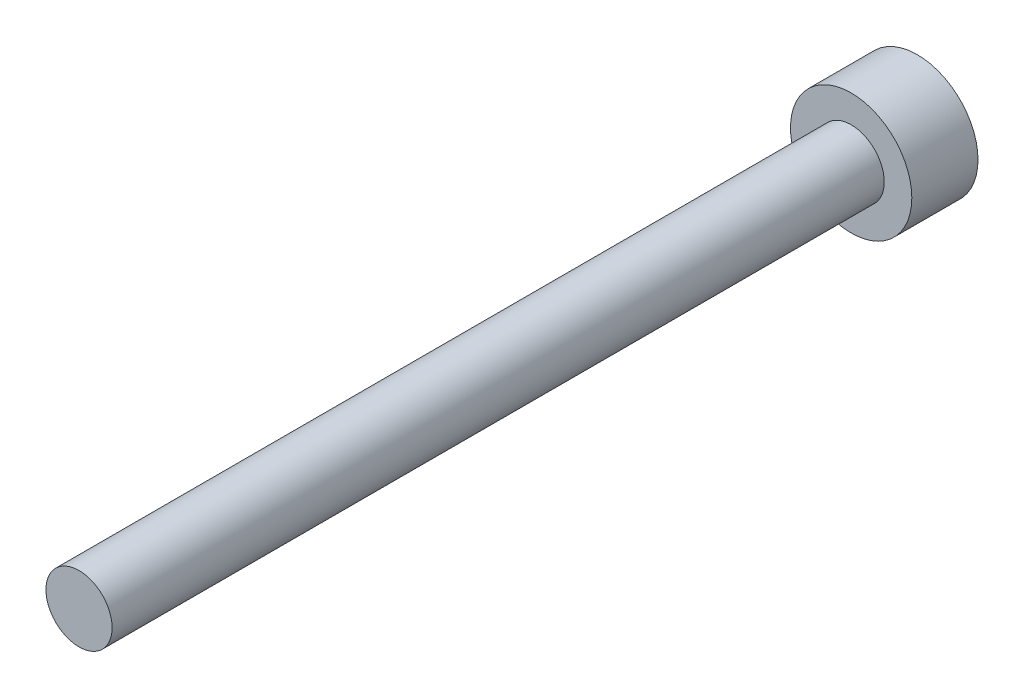
ISO-10303-21;
HEADER;
FILE_DESCRIPTION(('STEP AP214'),'2;1');
FILE_NAME('part.step','',(''),(''),'','','');
FILE_SCHEMA(('AUTOMOTIVE_DESIGN { 1 0 10303 214 1 1 1 1 }'));
ENDSEC;
DATA;
#1=APPLICATION_CONTEXT('core data for automotive mechanical design processes');
#2=APPLICATION_PROTOCOL_DEFINITION('international standard','automotive_design',2000,#1);
#3=PRODUCT_CONTEXT('',#1,'mechanical');
#4=PRODUCT('Part','Part','',(#3));
#5=PRODUCT_RELATED_PRODUCT_CATEGORY('part','',(#4));
#6=PRODUCT_DEFINITION_FORMATION('','',#4);
#7=PRODUCT_DEFINITION_CONTEXT('part definition',#1,'design');
#8=PRODUCT_DEFINITION('design','',#6,#7);
#9=PRODUCT_DEFINITION_SHAPE('','',#8);
#10=(LENGTH_UNIT() NAMED_UNIT(*) SI_UNIT(.MILLI.,.METRE.));
#11=(NAMED_UNIT(*) PLANE_ANGLE_UNIT() SI_UNIT($,.RADIAN.));
#12=(NAMED_UNIT(*) SI_UNIT($,.STERADIAN.) SOLID_ANGLE_UNIT());
#13=UNCERTAINTY_MEASURE_WITH_UNIT(LENGTH_MEASURE(1.E-05),#10,'distance_accuracy_value','');
#14=(GEOMETRIC_REPRESENTATION_CONTEXT(3) GLOBAL_UNCERTAINTY_ASSIGNED_CONTEXT((#13)) GLOBAL_UNIT_ASSIGNED_CONTEXT((#10,
#11,#12)) REPRESENTATION_CONTEXT('',''));
#15=CARTESIAN_POINT('',(0.,0.,0.));
#16=DIRECTION('',(0.,0.,1.));
#17=DIRECTION('',(1.,0.,0.));
#18=AXIS2_PLACEMENT_3D('',#15,#16,#17);
#19=CARTESIAN_POINT('',(0.,0.,-3.));
#20=DIRECTION('',(0.,0.,1.));
#21=DIRECTION('',(1.,0.,0.));
#22=AXIS2_PLACEMENT_3D('',#19,#20,#21);
#23=PLANE('',#22);
#24=CARTESIAN_POINT('',(0.,0.,-3.));
#25=DIRECTION('',(0.,0.,1.));
#26=DIRECTION('',(1.,0.,0.));
#27=AXIS2_PLACEMENT_3D('',#24,#25,#26);
#28=CIRCLE('',#27,2.75);
#29=CARTESIAN_POINT('',(2.75,0.,-3.));
#30=VERTEX_POINT('',#29);
#31=EDGE_CURVE('E47',#30,#30,#28,.T.);
#32=ORIENTED_EDGE('',*,*,#31,.F.);
#33=EDGE_LOOP('',(#32));
#34=FACE_BOUND('',#33,.T.);
#35=DIRECTION('',(0.5,0.866025403784439,0.));
#36=VECTOR('',#35,1.);
#37=CARTESIAN_POINT('',(0.721687836487032,-1.25,-3.));
#38=LINE('',#37,#36);
#39=CARTESIAN_POINT('',(0.721687836487032,-1.25,-3.));
#40=VERTEX_POINT('',#39);
#41=CARTESIAN_POINT('',(1.44337567297406,0.,-3.));
#42=VERTEX_POINT('',#41);
#43=EDGE_CURVE('E62',#40,#42,#38,.T.);
#44=ORIENTED_EDGE('',*,*,#43,.T.);
#45=DIRECTION('',(-0.5,0.866025403784439,0.));
#46=VECTOR('',#45,1.);
#47=CARTESIAN_POINT('',(1.44337567297406,0.,-3.));
#48=LINE('',#47,#46);
#49=CARTESIAN_POINT('',(0.721687836487032,1.25,-3.));
#50=VERTEX_POINT('',#49);
#51=EDGE_CURVE('E138',#42,#50,#48,.T.);
#52=ORIENTED_EDGE('',*,*,#51,.T.);
#53=DIRECTION('',(-1.,0.,0.));
#54=VECTOR('',#53,1.);
#55=CARTESIAN_POINT('',(0.721687836487032,1.25,-3.));
#56=LINE('',#55,#54);
#57=CARTESIAN_POINT('',(-0.721687836487032,1.25,-3.));
#58=VERTEX_POINT('',#57);
#59=EDGE_CURVE('E141',#50,#58,#56,.T.);
#60=ORIENTED_EDGE('',*,*,#59,.T.);
#61=DIRECTION('',(-0.5,-0.866025403784439,0.));
#62=VECTOR('',#61,1.);
#63=CARTESIAN_POINT('',(-0.721687836487032,1.25,-3.));
#64=LINE('',#63,#62);
#65=CARTESIAN_POINT('',(-1.44337567297406,0.,-3.));
#66=VERTEX_POINT('',#65);
#67=EDGE_CURVE('E150',#58,#66,#64,.T.);
#68=ORIENTED_EDGE('',*,*,#67,.T.);
#69=DIRECTION('',(0.5,-0.866025403784439,0.));
#70=VECTOR('',#69,1.);
#71=CARTESIAN_POINT('',(-1.44337567297406,0.,-3.));
#72=LINE('',#71,#70);
#73=CARTESIAN_POINT('',(-0.721687836487033,-1.25,-3.));
#74=VERTEX_POINT('',#73);
#75=EDGE_CURVE('E125',#66,#74,#72,.T.);
#76=ORIENTED_EDGE('',*,*,#75,.T.);
#77=DIRECTION('',(1.,0.,0.));
#78=VECTOR('',#77,1.);
#79=CARTESIAN_POINT('',(-0.721687836487033,-1.25,-3.));
#80=LINE('',#79,#78);
#81=EDGE_CURVE('E155',#74,#40,#80,.T.);
#82=ORIENTED_EDGE('',*,*,#81,.T.);
#83=EDGE_LOOP('',(#44,#52,#60,#68,#76,#82));
#84=FACE_BOUND('',#83,.T.);
#85=ADVANCED_FACE('F44',(#34,#84),#23,.F.);
#86=CARTESIAN_POINT('',(0.,0.,0.));
#87=DIRECTION('',(0.,0.,-1.));
#88=DIRECTION('',(-1.,0.,0.));
#89=AXIS2_PLACEMENT_3D('',#86,#87,#88);
#90=CYLINDRICAL_SURFACE('',#89,2.75);
#91=CARTESIAN_POINT('',(0.,0.,0.));
#92=DIRECTION('',(0.,0.,1.));
#93=DIRECTION('',(1.,0.,0.));
#94=AXIS2_PLACEMENT_3D('',#91,#92,#93);
#95=CIRCLE('',#94,2.75);
#96=CARTESIAN_POINT('',(2.75,0.,0.));
#97=VERTEX_POINT('',#96);
#98=EDGE_CURVE('E54',#97,#97,#95,.T.);
#99=ORIENTED_EDGE('',*,*,#98,.F.);
#100=EDGE_LOOP('',(#99));
#101=FACE_BOUND('',#100,.T.);
#102=ORIENTED_EDGE('',*,*,#31,.T.);
#103=EDGE_LOOP('',(#102));
#104=FACE_BOUND('',#103,.T.);
#105=ADVANCED_FACE('F50',(#101,#104),#90,.T.);
#106=CARTESIAN_POINT('',(0.,0.,0.));
#107=DIRECTION('',(0.,0.,1.));
#108=DIRECTION('',(1.,0.,0.));
#109=AXIS2_PLACEMENT_3D('',#106,#107,#108);
#110=PLANE('',#109);
#111=CARTESIAN_POINT('',(0.,0.,0.));
#112=DIRECTION('',(0.,0.,1.));
#113=DIRECTION('',(1.,0.,0.));
#114=AXIS2_PLACEMENT_3D('',#111,#112,#113);
#115=CIRCLE('',#114,1.5);
#116=CARTESIAN_POINT('',(1.5,0.,0.));
#117=VERTEX_POINT('',#116);
#118=EDGE_CURVE('E11',#117,#117,#115,.T.);
#119=ORIENTED_EDGE('',*,*,#118,.F.);
#120=EDGE_LOOP('',(#119));
#121=FACE_BOUND('',#120,.T.);
#122=ORIENTED_EDGE('',*,*,#98,.T.);
#123=EDGE_LOOP('',(#122));
#124=FACE_BOUND('',#123,.T.);
#125=ADVANCED_FACE('F212',(#121,#124),#110,.T.);
#126=CARTESIAN_POINT('',(0.,0.,35.));
#127=DIRECTION('',(0.,0.,-1.));
#128=DIRECTION('',(-1.,0.,0.));
#129=AXIS2_PLACEMENT_3D('',#126,#127,#128);
#130=CYLINDRICAL_SURFACE('',#129,1.5);
#131=CARTESIAN_POINT('',(0.,0.,35.));
#132=DIRECTION('',(0.,0.,1.));
#133=DIRECTION('',(1.,0.,0.));
#134=AXIS2_PLACEMENT_3D('',#131,#132,#133);
#135=CIRCLE('',#134,1.5);
#136=CARTESIAN_POINT('',(1.5,0.,35.));
#137=VERTEX_POINT('',#136);
#138=EDGE_CURVE('E166',#137,#137,#135,.T.);
#139=ORIENTED_EDGE('',*,*,#138,.F.);
#140=EDGE_LOOP('',(#139));
#141=FACE_BOUND('',#140,.T.);
#142=ORIENTED_EDGE('',*,*,#118,.T.);
#143=EDGE_LOOP('',(#142));
#144=FACE_BOUND('',#143,.T.);
#145=ADVANCED_FACE('F209',(#141,#144),#130,.T.);
#146=CARTESIAN_POINT('',(0.,0.,35.));
#147=DIRECTION('',(0.,0.,1.));
#148=DIRECTION('',(1.,0.,0.));
#149=AXIS2_PLACEMENT_3D('',#146,#147,#148);
#150=PLANE('',#149);
#151=ORIENTED_EDGE('',*,*,#138,.T.);
#152=EDGE_LOOP('',(#151));
#153=FACE_BOUND('',#152,.T.);
#154=ADVANCED_FACE('F204',(#153),#150,.T.);
#155=CARTESIAN_POINT('',(0.721687836487032,-1.25,-1.7));
#156=DIRECTION('',(-0.866025403784439,0.5,0.));
#157=DIRECTION('',(-0.5,-0.866025403784439,0.));
#158=AXIS2_PLACEMENT_3D('',#155,#156,#157);
#159=PLANE('',#158);
#160=ORIENTED_EDGE('',*,*,#43,.F.);
#161=DIRECTION('',(0.,0.,-1.));
#162=VECTOR('',#161,1.);
#163=CARTESIAN_POINT('',(0.721687836487032,-1.25,-1.7));
#164=LINE('',#163,#162);
#165=CARTESIAN_POINT('',(0.721687836487032,-1.25,-1.7));
#166=VERTEX_POINT('',#165);
#167=EDGE_CURVE('E132',#166,#40,#164,.T.);
#168=ORIENTED_EDGE('',*,*,#167,.F.);
#169=DIRECTION('',(0.5,0.866025403784439,0.));
#170=VECTOR('',#169,1.);
#171=CARTESIAN_POINT('',(0.721687836487032,-1.25,-1.7));
#172=LINE('',#171,#170);
#173=CARTESIAN_POINT('',(1.44337567297406,0.,-1.7));
#174=VERTEX_POINT('',#173);
#175=EDGE_CURVE('E156',#166,#174,#172,.T.);
#176=ORIENTED_EDGE('',*,*,#175,.T.);
#177=DIRECTION('',(0.,0.,-1.));
#178=VECTOR('',#177,1.);
#179=CARTESIAN_POINT('',(1.44337567297406,0.,-1.7));
#180=LINE('',#179,#178);
#181=EDGE_CURVE('E167',#174,#42,#180,.T.);
#182=ORIENTED_EDGE('',*,*,#181,.T.);
#183=EDGE_LOOP('',(#160,#168,#176,#182));
#184=FACE_BOUND('',#183,.T.);
#185=ADVANCED_FACE('F184',(#184),#159,.T.);
#186=CARTESIAN_POINT('',(1.44337567297406,0.,-1.7));
#187=DIRECTION('',(-0.866025403784439,-0.5,0.));
#188=DIRECTION('',(0.5,-0.866025403784439,0.));
#189=AXIS2_PLACEMENT_3D('',#186,#187,#188);
#190=PLANE('',#189);
#191=ORIENTED_EDGE('',*,*,#51,.F.);
#192=ORIENTED_EDGE('',*,*,#181,.F.);
#193=DIRECTION('',(-0.5,0.866025403784439,0.));
#194=VECTOR('',#193,1.);
#195=CARTESIAN_POINT('',(1.44337567297406,0.,-1.7));
#196=LINE('',#195,#194);
#197=CARTESIAN_POINT('',(0.721687836487032,1.25,-1.7));
#198=VERTEX_POINT('',#197);
#199=EDGE_CURVE('E105',#174,#198,#196,.T.);
#200=ORIENTED_EDGE('',*,*,#199,.T.);
#201=DIRECTION('',(0.,0.,-1.));
#202=VECTOR('',#201,1.);
#203=CARTESIAN_POINT('',(0.721687836487032,1.25,-1.7));
#204=LINE('',#203,#202);
#205=EDGE_CURVE('E162',#198,#50,#204,.T.);
#206=ORIENTED_EDGE('',*,*,#205,.T.);
#207=EDGE_LOOP('',(#191,#192,#200,#206));
#208=FACE_BOUND('',#207,.T.);
#209=ADVANCED_FACE('F198',(#208),#190,.T.);
#210=CARTESIAN_POINT('',(0.721687836487032,1.25,-1.7));
#211=DIRECTION('',(0.,-1.,0.));
#212=DIRECTION('',(1.,0.,0.));
#213=AXIS2_PLACEMENT_3D('',#210,#211,#212);
#214=PLANE('',#213);
#215=ORIENTED_EDGE('',*,*,#59,.F.);
#216=ORIENTED_EDGE('',*,*,#205,.F.);
#217=DIRECTION('',(-1.,0.,0.));
#218=VECTOR('',#217,1.);
#219=CARTESIAN_POINT('',(0.721687836487032,1.25,-1.7));
#220=LINE('',#219,#218);
#221=CARTESIAN_POINT('',(-0.721687836487032,1.25,-1.7));
#222=VERTEX_POINT('',#221);
#223=EDGE_CURVE('E121',#198,#222,#220,.T.);
#224=ORIENTED_EDGE('',*,*,#223,.T.);
#225=DIRECTION('',(0.,0.,-1.));
#226=VECTOR('',#225,1.);
#227=CARTESIAN_POINT('',(-0.721687836487032,1.25,-1.7));
#228=LINE('',#227,#226);
#229=EDGE_CURVE('E119',#222,#58,#228,.T.);
#230=ORIENTED_EDGE('',*,*,#229,.T.);
#231=EDGE_LOOP('',(#215,#216,#224,#230));
#232=FACE_BOUND('',#231,.T.);
#233=ADVANCED_FACE('F193',(#232),#214,.T.);
#234=CARTESIAN_POINT('',(-0.721687836487032,1.25,-1.7));
#235=DIRECTION('',(0.866025403784439,-0.5,0.));
#236=DIRECTION('',(0.5,0.866025403784439,0.));
#237=AXIS2_PLACEMENT_3D('',#234,#235,#236);
#238=PLANE('',#237);
#239=ORIENTED_EDGE('',*,*,#67,.F.);
#240=ORIENTED_EDGE('',*,*,#229,.F.);
#241=DIRECTION('',(-0.5,-0.866025403784439,0.));
#242=VECTOR('',#241,1.);
#243=CARTESIAN_POINT('',(-0.721687836487032,1.25,-1.7));
#244=LINE('',#243,#242);
#245=CARTESIAN_POINT('',(-1.44337567297406,0.,-1.7));
#246=VERTEX_POINT('',#245);
#247=EDGE_CURVE('E115',#222,#246,#244,.T.);
#248=ORIENTED_EDGE('',*,*,#247,.T.);
#249=DIRECTION('',(0.,0.,-1.));
#250=VECTOR('',#249,1.);
#251=CARTESIAN_POINT('',(-1.44337567297406,0.,-1.7));
#252=LINE('',#251,#250);
#253=EDGE_CURVE('E118',#246,#66,#252,.T.);
#254=ORIENTED_EDGE('',*,*,#253,.T.);
#255=EDGE_LOOP('',(#239,#240,#248,#254));
#256=FACE_BOUND('',#255,.T.);
#257=ADVANCED_FACE('F113',(#256),#238,.T.);
#258=CARTESIAN_POINT('',(-1.44337567297406,0.,-1.7));
#259=DIRECTION('',(0.866025403784439,0.5,0.));
#260=DIRECTION('',(-0.5,0.866025403784439,0.));
#261=AXIS2_PLACEMENT_3D('',#258,#259,#260);
#262=PLANE('',#261);
#263=ORIENTED_EDGE('',*,*,#75,.F.);
#264=ORIENTED_EDGE('',*,*,#253,.F.);
#265=DIRECTION('',(0.5,-0.866025403784439,0.));
#266=VECTOR('',#265,1.);
#267=CARTESIAN_POINT('',(-1.44337567297406,0.,-1.7));
#268=LINE('',#267,#266);
#269=CARTESIAN_POINT('',(-0.721687836487033,-1.25,-1.7));
#270=VERTEX_POINT('',#269);
#271=EDGE_CURVE('E116',#246,#270,#268,.T.);
#272=ORIENTED_EDGE('',*,*,#271,.T.);
#273=DIRECTION('',(0.,0.,-1.));
#274=VECTOR('',#273,1.);
#275=CARTESIAN_POINT('',(-0.721687836487033,-1.25,-1.7));
#276=LINE('',#275,#274);
#277=EDGE_CURVE('E91',#270,#74,#276,.T.);
#278=ORIENTED_EDGE('',*,*,#277,.T.);
#279=EDGE_LOOP('',(#263,#264,#272,#278));
#280=FACE_BOUND('',#279,.T.);
#281=ADVANCED_FACE('F124',(#280),#262,.T.);
#282=CARTESIAN_POINT('',(-0.721687836487033,-1.25,-1.7));
#283=DIRECTION('',(0.,1.,0.));
#284=DIRECTION('',(-1.,0.,0.));
#285=AXIS2_PLACEMENT_3D('',#282,#283,#284);
#286=PLANE('',#285);
#287=ORIENTED_EDGE('',*,*,#81,.F.);
#288=ORIENTED_EDGE('',*,*,#277,.F.);
#289=DIRECTION('',(1.,0.,0.));
#290=VECTOR('',#289,1.);
#291=CARTESIAN_POINT('',(-0.721687836487033,-1.25,-1.7));
#292=LINE('',#291,#290);
#293=EDGE_CURVE('E72',#270,#166,#292,.T.);
#294=ORIENTED_EDGE('',*,*,#293,.T.);
#295=ORIENTED_EDGE('',*,*,#167,.T.);
#296=EDGE_LOOP('',(#287,#288,#294,#295));
#297=FACE_BOUND('',#296,.T.);
#298=ADVANCED_FACE('F181',(#297),#286,.T.);
#299=CARTESIAN_POINT('',(0.,0.,-1.7));
#300=DIRECTION('',(0.,0.,1.));
#301=DIRECTION('',(1.,0.,0.));
#302=AXIS2_PLACEMENT_3D('',#299,#300,#301);
#303=PLANE('',#302);
#304=ORIENTED_EDGE('',*,*,#175,.F.);
#305=ORIENTED_EDGE('',*,*,#293,.F.);
#306=ORIENTED_EDGE('',*,*,#271,.F.);
#307=ORIENTED_EDGE('',*,*,#247,.F.);
#308=ORIENTED_EDGE('',*,*,#223,.F.);
#309=ORIENTED_EDGE('',*,*,#199,.F.);
#310=EDGE_LOOP('',(#304,#305,#306,#307,#308,#309));
#311=FACE_BOUND('',#310,.T.);
#312=ADVANCED_FACE('F129',(#311),#303,.F.);
#313=CLOSED_SHELL('',(#85,#105,#125,#145,#154,#185,#209,#233,#257,#281,#298,#312));
#314=MANIFOLD_SOLID_BREP('B2',#313);
#315=ADVANCED_BREP_SHAPE_REPRESENTATION('',(#18,#314),#14);
#316=SHAPE_DEFINITION_REPRESENTATION(#9,#315);
ENDSEC;
END-ISO-10303-21;
